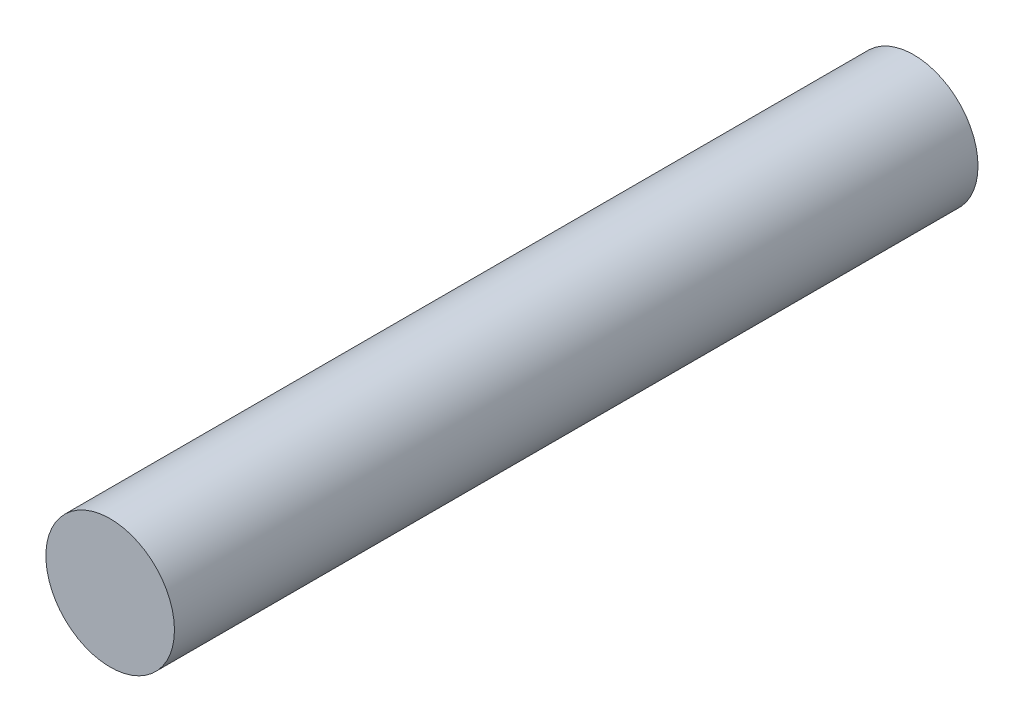
ISO-10303-21;
HEADER;
FILE_DESCRIPTION(('STEP AP214'),'2;1');
FILE_NAME('part.step','',(''),(''),'','','');
FILE_SCHEMA(('AUTOMOTIVE_DESIGN { 1 0 10303 214 1 1 1 1 }'));
ENDSEC;
DATA;
#1=APPLICATION_CONTEXT('core data for automotive mechanical design processes');
#2=APPLICATION_PROTOCOL_DEFINITION('international standard','automotive_design',2000,#1);
#3=PRODUCT_CONTEXT('',#1,'mechanical');
#4=PRODUCT('Part','Part','',(#3));
#5=PRODUCT_RELATED_PRODUCT_CATEGORY('part','',(#4));
#6=PRODUCT_DEFINITION_FORMATION('','',#4);
#7=PRODUCT_DEFINITION_CONTEXT('part definition',#1,'design');
#8=PRODUCT_DEFINITION('design','',#6,#7);
#9=PRODUCT_DEFINITION_SHAPE('','',#8);
#10=(LENGTH_UNIT() NAMED_UNIT(*) SI_UNIT(.MILLI.,.METRE.));
#11=(NAMED_UNIT(*) PLANE_ANGLE_UNIT() SI_UNIT($,.RADIAN.));
#12=(NAMED_UNIT(*) SI_UNIT($,.STERADIAN.) SOLID_ANGLE_UNIT());
#13=UNCERTAINTY_MEASURE_WITH_UNIT(LENGTH_MEASURE(1.E-05),#10,'distance_accuracy_value','');
#14=(GEOMETRIC_REPRESENTATION_CONTEXT(3) GLOBAL_UNCERTAINTY_ASSIGNED_CONTEXT((#13)) GLOBAL_UNIT_ASSIGNED_CONTEXT((#10,
#11,#12)) REPRESENTATION_CONTEXT('',''));
#15=CARTESIAN_POINT('',(0.,0.,0.));
#16=DIRECTION('',(0.,0.,1.));
#17=DIRECTION('',(1.,0.,0.));
#18=AXIS2_PLACEMENT_3D('',#15,#16,#17);
#19=CARTESIAN_POINT('',(0.,0.,50.));
#20=DIRECTION('',(0.,0.,-1.));
#21=DIRECTION('',(-1.,0.,0.));
#22=AXIS2_PLACEMENT_3D('',#19,#20,#21);
#23=CYLINDRICAL_SURFACE('',#22,8.);
#24=CARTESIAN_POINT('',(0.,0.,50.));
#25=DIRECTION('',(0.,0.,1.));
#26=DIRECTION('',(1.,0.,0.));
#27=AXIS2_PLACEMENT_3D('',#24,#25,#26);
#28=CIRCLE('',#27,8.);
#29=CARTESIAN_POINT('',(8.,0.,50.));
#30=VERTEX_POINT('',#29);
#31=EDGE_CURVE('E10',#30,#30,#28,.T.);
#32=ORIENTED_EDGE('',*,*,#31,.F.);
#33=EDGE_LOOP('',(#32));
#34=FACE_BOUND('',#33,.T.);
#35=CARTESIAN_POINT('',(0.,0.,-50.));
#36=DIRECTION('',(0.,0.,1.));
#37=DIRECTION('',(1.,0.,0.));
#38=AXIS2_PLACEMENT_3D('',#35,#36,#37);
#39=CIRCLE('',#38,8.);
#40=CARTESIAN_POINT('',(8.,0.,-50.));
#41=VERTEX_POINT('',#40);
#42=EDGE_CURVE('E34',#41,#41,#39,.T.);
#43=ORIENTED_EDGE('',*,*,#42,.T.);
#44=EDGE_LOOP('',(#43));
#45=FACE_BOUND('',#44,.T.);
#46=ADVANCED_FACE('F31',(#34,#45),#23,.T.);
#47=CARTESIAN_POINT('',(0.,0.,50.));
#48=DIRECTION('',(0.,0.,1.));
#49=DIRECTION('',(1.,0.,0.));
#50=AXIS2_PLACEMENT_3D('',#47,#48,#49);
#51=PLANE('',#50);
#52=ORIENTED_EDGE('',*,*,#31,.T.);
#53=EDGE_LOOP('',(#52));
#54=FACE_BOUND('',#53,.T.);
#55=ADVANCED_FACE('F46',(#54),#51,.T.);
#56=CARTESIAN_POINT('',(0.,0.,-50.));
#57=DIRECTION('',(0.,0.,1.));
#58=DIRECTION('',(1.,0.,0.));
#59=AXIS2_PLACEMENT_3D('',#56,#57,#58);
#60=PLANE('',#59);
#61=ORIENTED_EDGE('',*,*,#42,.F.);
#62=EDGE_LOOP('',(#61));
#63=FACE_BOUND('',#62,.T.);
#64=ADVANCED_FACE('F44',(#63),#60,.F.);
#65=CLOSED_SHELL('',(#46,#55,#64));
#66=MANIFOLD_SOLID_BREP('B2',#65);
#67=ADVANCED_BREP_SHAPE_REPRESENTATION('',(#18,#66),#14);
#68=SHAPE_DEFINITION_REPRESENTATION(#9,#67);
ENDSEC;
END-ISO-10303-21;
